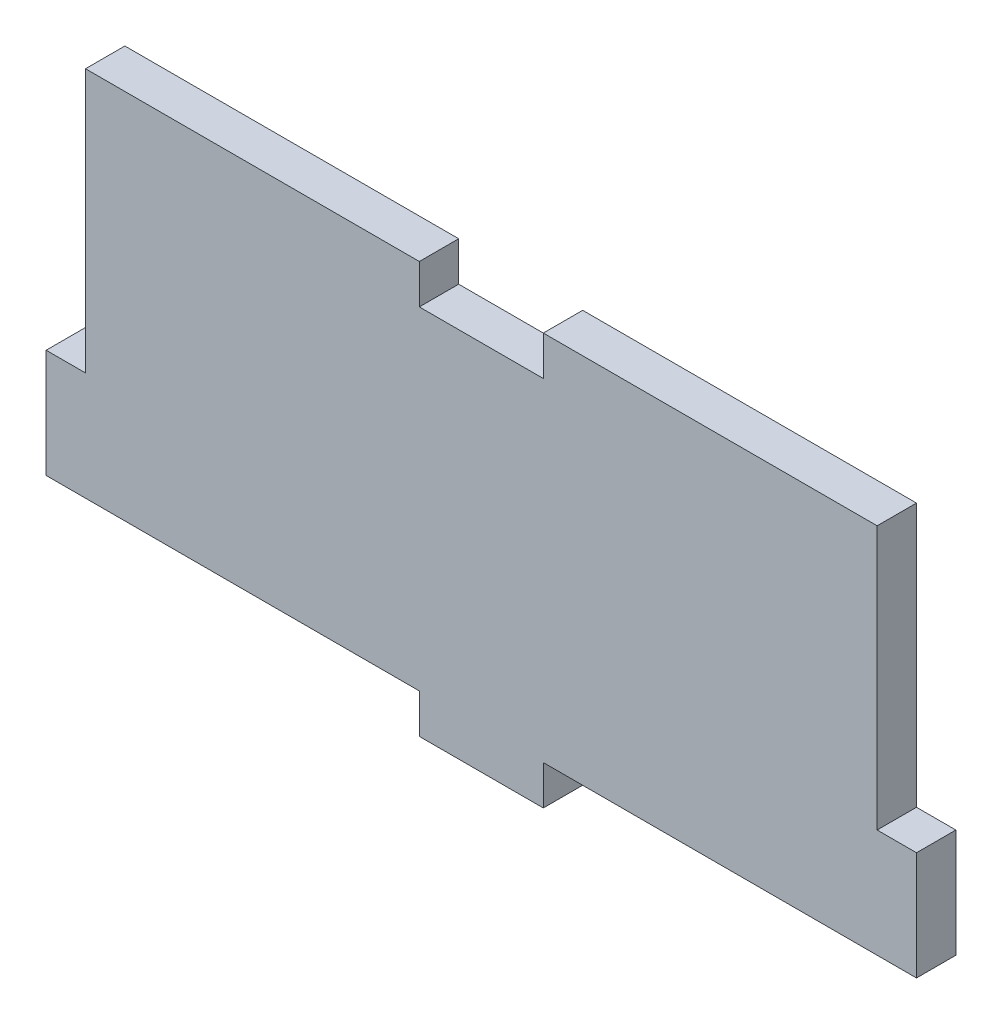
ISO-10303-21;
HEADER;
FILE_DESCRIPTION(('STEP AP214'),'2;1');
FILE_NAME('part.step','',(''),(''),'','','');
FILE_SCHEMA(('AUTOMOTIVE_DESIGN { 1 0 10303 214 1 1 1 1 }'));
ENDSEC;
DATA;
#1=APPLICATION_CONTEXT('core data for automotive mechanical design processes');
#2=APPLICATION_PROTOCOL_DEFINITION('international standard','automotive_design',2000,#1);
#3=PRODUCT_CONTEXT('',#1,'mechanical');
#4=PRODUCT('Part','Part','',(#3));
#5=PRODUCT_RELATED_PRODUCT_CATEGORY('part','',(#4));
#6=PRODUCT_DEFINITION_FORMATION('','',#4);
#7=PRODUCT_DEFINITION_CONTEXT('part definition',#1,'design');
#8=PRODUCT_DEFINITION('design','',#6,#7);
#9=PRODUCT_DEFINITION_SHAPE('','',#8);
#10=(LENGTH_UNIT() NAMED_UNIT(*) SI_UNIT(.MILLI.,.METRE.));
#11=(NAMED_UNIT(*) PLANE_ANGLE_UNIT() SI_UNIT($,.RADIAN.));
#12=(NAMED_UNIT(*) SI_UNIT($,.STERADIAN.) SOLID_ANGLE_UNIT());
#13=UNCERTAINTY_MEASURE_WITH_UNIT(LENGTH_MEASURE(1.E-05),#10,'distance_accuracy_value','');
#14=(GEOMETRIC_REPRESENTATION_CONTEXT(3) GLOBAL_UNCERTAINTY_ASSIGNED_CONTEXT((#13)) GLOBAL_UNIT_ASSIGNED_CONTEXT((#10,
#11,#12)) REPRESENTATION_CONTEXT('',''));
#15=CARTESIAN_POINT('',(0.,0.,0.));
#16=DIRECTION('',(0.,0.,1.));
#17=DIRECTION('',(1.,0.,0.));
#18=AXIS2_PLACEMENT_3D('',#15,#16,#17);
#19=CARTESIAN_POINT('',(-127.7,60.,12.7));
#20=DIRECTION('',(0.,1.,0.));
#21=DIRECTION('',(0.,0.,1.));
#22=AXIS2_PLACEMENT_3D('',#19,#20,#21);
#23=PLANE('',#22);
#24=DIRECTION('',(0.,0.,1.));
#25=VECTOR('',#24,1.);
#26=CARTESIAN_POINT('',(-20.,60.,0.));
#27=LINE('',#26,#25);
#28=CARTESIAN_POINT('',(-20.,60.,0.));
#29=VERTEX_POINT('',#28);
#30=CARTESIAN_POINT('',(-20.,60.,12.7));
#31=VERTEX_POINT('',#30);
#32=EDGE_CURVE('E175',#29,#31,#27,.T.);
#33=ORIENTED_EDGE('',*,*,#32,.F.);
#34=DIRECTION('',(1.,0.,0.));
#35=VECTOR('',#34,1.);
#36=CARTESIAN_POINT('',(-127.7,60.,0.));
#37=LINE('',#36,#35);
#38=CARTESIAN_POINT('',(-127.7,60.,0.));
#39=VERTEX_POINT('',#38);
#40=EDGE_CURVE('E277',#39,#29,#37,.T.);
#41=ORIENTED_EDGE('',*,*,#40,.F.);
#42=DIRECTION('',(0.,0.,-1.));
#43=VECTOR('',#42,1.);
#44=CARTESIAN_POINT('',(-127.7,60.,12.7));
#45=LINE('',#44,#43);
#46=CARTESIAN_POINT('',(-127.7,60.,12.7));
#47=VERTEX_POINT('',#46);
#48=EDGE_CURVE('E196',#47,#39,#45,.T.);
#49=ORIENTED_EDGE('',*,*,#48,.F.);
#50=DIRECTION('',(1.,0.,0.));
#51=VECTOR('',#50,1.);
#52=CARTESIAN_POINT('',(-127.7,60.,12.7));
#53=LINE('',#52,#51);
#54=EDGE_CURVE('E203',#47,#31,#53,.T.);
#55=ORIENTED_EDGE('',*,*,#54,.T.);
#56=EDGE_LOOP('',(#33,#41,#49,#55));
#57=FACE_BOUND('',#56,.T.);
#58=ADVANCED_FACE('F87',(#57),#23,.T.);
#59=DIRECTION('',(0.,0.,1.));
#60=VECTOR('',#59,1.);
#61=CARTESIAN_POINT('',(20.,60.,0.));
#62=LINE('',#61,#60);
#63=CARTESIAN_POINT('',(20.,60.,0.));
#64=VERTEX_POINT('',#63);
#65=CARTESIAN_POINT('',(20.,60.,12.7));
#66=VERTEX_POINT('',#65);
#67=EDGE_CURVE('E301',#64,#66,#62,.T.);
#68=ORIENTED_EDGE('',*,*,#67,.T.);
#69=CARTESIAN_POINT('',(127.7,60.,12.7));
#70=VERTEX_POINT('',#69);
#71=EDGE_CURVE('E287',#66,#70,#53,.T.);
#72=ORIENTED_EDGE('',*,*,#71,.T.);
#73=DIRECTION('',(0.,0.,-1.));
#74=VECTOR('',#73,1.);
#75=CARTESIAN_POINT('',(127.7,60.,12.7));
#76=LINE('',#75,#74);
#77=CARTESIAN_POINT('',(127.7,60.,0.));
#78=VERTEX_POINT('',#77);
#79=EDGE_CURVE('E190',#70,#78,#76,.T.);
#80=ORIENTED_EDGE('',*,*,#79,.T.);
#81=EDGE_CURVE('E280',#64,#78,#37,.T.);
#82=ORIENTED_EDGE('',*,*,#81,.F.);
#83=EDGE_LOOP('',(#68,#72,#80,#82));
#84=FACE_BOUND('',#83,.T.);
#85=ADVANCED_FACE('F298',(#84),#23,.T.);
#86=CARTESIAN_POINT('',(0.,0.,0.));
#87=DIRECTION('',(0.,0.,1.));
#88=DIRECTION('',(1.,0.,0.));
#89=AXIS2_PLACEMENT_3D('',#86,#87,#88);
#90=PLANE('',#89);
#91=ORIENTED_EDGE('',*,*,#40,.T.);
#92=DIRECTION('',(0.,-1.,0.));
#93=VECTOR('',#92,1.);
#94=CARTESIAN_POINT('',(-20.,60.,0.));
#95=LINE('',#94,#93);
#96=CARTESIAN_POINT('',(-20.,47.3,0.));
#97=VERTEX_POINT('',#96);
#98=EDGE_CURVE('E503',#29,#97,#95,.T.);
#99=ORIENTED_EDGE('',*,*,#98,.T.);
#100=DIRECTION('',(1.,0.,0.));
#101=VECTOR('',#100,1.);
#102=CARTESIAN_POINT('',(-20.,47.3,0.));
#103=LINE('',#102,#101);
#104=CARTESIAN_POINT('',(20.,47.3,0.));
#105=VERTEX_POINT('',#104);
#106=EDGE_CURVE('E506',#97,#105,#103,.T.);
#107=ORIENTED_EDGE('',*,*,#106,.T.);
#108=DIRECTION('',(0.,1.,0.));
#109=VECTOR('',#108,1.);
#110=CARTESIAN_POINT('',(20.,60.,0.));
#111=LINE('',#110,#109);
#112=EDGE_CURVE('E294',#105,#64,#111,.T.);
#113=ORIENTED_EDGE('',*,*,#112,.T.);
#114=ORIENTED_EDGE('',*,*,#81,.T.);
#115=DIRECTION('',(0.,-1.,0.));
#116=VECTOR('',#115,1.);
#117=CARTESIAN_POINT('',(127.7,60.,0.));
#118=LINE('',#117,#116);
#119=CARTESIAN_POINT('',(127.7,-25.,0.));
#120=VERTEX_POINT('',#119);
#121=EDGE_CURVE('E181',#78,#120,#118,.T.);
#122=ORIENTED_EDGE('',*,*,#121,.T.);
#123=DIRECTION('',(1.,0.,0.));
#124=VECTOR('',#123,1.);
#125=CARTESIAN_POINT('',(127.7,-25.,0.));
#126=LINE('',#125,#124);
#127=CARTESIAN_POINT('',(140.4,-25.,0.));
#128=VERTEX_POINT('',#127);
#129=EDGE_CURVE('E163',#120,#128,#126,.T.);
#130=ORIENTED_EDGE('',*,*,#129,.T.);
#131=DIRECTION('',(0.,1.,0.));
#132=VECTOR('',#131,1.);
#133=CARTESIAN_POINT('',(140.4,-60.,0.));
#134=LINE('',#133,#132);
#135=CARTESIAN_POINT('',(140.4,-60.,0.));
#136=VERTEX_POINT('',#135);
#137=EDGE_CURVE('E171',#136,#128,#134,.T.);
#138=ORIENTED_EDGE('',*,*,#137,.F.);
#139=DIRECTION('',(1.,0.,0.));
#140=VECTOR('',#139,1.);
#141=CARTESIAN_POINT('',(-127.7,-60.,0.));
#142=LINE('',#141,#140);
#143=CARTESIAN_POINT('',(20.,-60.,0.));
#144=VERTEX_POINT('',#143);
#145=EDGE_CURVE('E263',#144,#136,#142,.T.);
#146=ORIENTED_EDGE('',*,*,#145,.F.);
#147=DIRECTION('',(0.,-1.,0.));
#148=VECTOR('',#147,1.);
#149=CARTESIAN_POINT('',(20.,-60.,0.));
#150=LINE('',#149,#148);
#151=CARTESIAN_POINT('',(20.,-72.7,0.));
#152=VERTEX_POINT('',#151);
#153=EDGE_CURVE('E211',#144,#152,#150,.T.);
#154=ORIENTED_EDGE('',*,*,#153,.T.);
#155=DIRECTION('',(1.,0.,0.));
#156=VECTOR('',#155,1.);
#157=CARTESIAN_POINT('',(-20.,-72.7,0.));
#158=LINE('',#157,#156);
#159=CARTESIAN_POINT('',(-20.,-72.7,0.));
#160=VERTEX_POINT('',#159);
#161=EDGE_CURVE('E220',#160,#152,#158,.T.);
#162=ORIENTED_EDGE('',*,*,#161,.F.);
#163=DIRECTION('',(0.,-1.,0.));
#164=VECTOR('',#163,1.);
#165=CARTESIAN_POINT('',(-20.,-60.,0.));
#166=LINE('',#165,#164);
#167=CARTESIAN_POINT('',(-20.,-60.,0.));
#168=VERTEX_POINT('',#167);
#169=EDGE_CURVE('E217',#168,#160,#166,.T.);
#170=ORIENTED_EDGE('',*,*,#169,.F.);
#171=CARTESIAN_POINT('',(-140.4,-60.,0.));
#172=VERTEX_POINT('',#171);
#173=EDGE_CURVE('E259',#172,#168,#142,.T.);
#174=ORIENTED_EDGE('',*,*,#173,.F.);
#175=DIRECTION('',(0.,1.,0.));
#176=VECTOR('',#175,1.);
#177=CARTESIAN_POINT('',(-140.4,-60.,0.));
#178=LINE('',#177,#176);
#179=CARTESIAN_POINT('',(-140.4,-25.,0.));
#180=VERTEX_POINT('',#179);
#181=EDGE_CURVE('E236',#172,#180,#178,.T.);
#182=ORIENTED_EDGE('',*,*,#181,.T.);
#183=DIRECTION('',(-1.,0.,0.));
#184=VECTOR('',#183,1.);
#185=CARTESIAN_POINT('',(-127.7,-25.,0.));
#186=LINE('',#185,#184);
#187=CARTESIAN_POINT('',(-127.7,-25.,0.));
#188=VERTEX_POINT('',#187);
#189=EDGE_CURVE('E240',#188,#180,#186,.T.);
#190=ORIENTED_EDGE('',*,*,#189,.F.);
#191=DIRECTION('',(0.,-1.,0.));
#192=VECTOR('',#191,1.);
#193=CARTESIAN_POINT('',(-127.7,60.,0.));
#194=LINE('',#193,#192);
#195=EDGE_CURVE('E232',#39,#188,#194,.T.);
#196=ORIENTED_EDGE('',*,*,#195,.F.);
#197=EDGE_LOOP('',(#91,#99,#107,#113,#114,#122,#130,#138,#146,#154,#162,#170,#174,#182,#190,#196));
#198=FACE_BOUND('',#197,.T.);
#199=ADVANCED_FACE('F178',(#198),#90,.F.);
#200=CARTESIAN_POINT('',(0.,0.,12.7));
#201=DIRECTION('',(0.,0.,1.));
#202=DIRECTION('',(1.,0.,0.));
#203=AXIS2_PLACEMENT_3D('',#200,#201,#202);
#204=PLANE('',#203);
#205=DIRECTION('',(0.,-1.,0.));
#206=VECTOR('',#205,1.);
#207=CARTESIAN_POINT('',(-20.,60.,12.7));
#208=LINE('',#207,#206);
#209=CARTESIAN_POINT('',(-20.,47.3,12.7));
#210=VERTEX_POINT('',#209);
#211=EDGE_CURVE('E104',#31,#210,#208,.T.);
#212=ORIENTED_EDGE('',*,*,#211,.F.);
#213=ORIENTED_EDGE('',*,*,#54,.F.);
#214=DIRECTION('',(0.,-1.,0.));
#215=VECTOR('',#214,1.);
#216=CARTESIAN_POINT('',(-127.7,60.,12.7));
#217=LINE('',#216,#215);
#218=CARTESIAN_POINT('',(-127.7,-25.,12.7));
#219=VERTEX_POINT('',#218);
#220=EDGE_CURVE('E273',#47,#219,#217,.T.);
#221=ORIENTED_EDGE('',*,*,#220,.T.);
#222=DIRECTION('',(-1.,0.,0.));
#223=VECTOR('',#222,1.);
#224=CARTESIAN_POINT('',(-127.7,-25.,12.7));
#225=LINE('',#224,#223);
#226=CARTESIAN_POINT('',(-140.4,-25.,12.7));
#227=VERTEX_POINT('',#226);
#228=EDGE_CURVE('E233',#219,#227,#225,.T.);
#229=ORIENTED_EDGE('',*,*,#228,.T.);
#230=DIRECTION('',(0.,1.,0.));
#231=VECTOR('',#230,1.);
#232=CARTESIAN_POINT('',(-140.4,-60.,12.7));
#233=LINE('',#232,#231);
#234=CARTESIAN_POINT('',(-140.4,-60.,12.7));
#235=VERTEX_POINT('',#234);
#236=EDGE_CURVE('E235',#235,#227,#233,.T.);
#237=ORIENTED_EDGE('',*,*,#236,.F.);
#238=DIRECTION('',(1.,0.,0.));
#239=VECTOR('',#238,1.);
#240=CARTESIAN_POINT('',(-127.7,-60.,12.7));
#241=LINE('',#240,#239);
#242=CARTESIAN_POINT('',(-20.,-60.,12.7));
#243=VERTEX_POINT('',#242);
#244=EDGE_CURVE('E267',#235,#243,#241,.T.);
#245=ORIENTED_EDGE('',*,*,#244,.T.);
#246=DIRECTION('',(0.,-1.,0.));
#247=VECTOR('',#246,1.);
#248=CARTESIAN_POINT('',(-20.,-60.,12.7));
#249=LINE('',#248,#247);
#250=CARTESIAN_POINT('',(-20.,-72.7,12.7));
#251=VERTEX_POINT('',#250);
#252=EDGE_CURVE('E207',#243,#251,#249,.T.);
#253=ORIENTED_EDGE('',*,*,#252,.T.);
#254=DIRECTION('',(1.,0.,0.));
#255=VECTOR('',#254,1.);
#256=CARTESIAN_POINT('',(-20.,-72.7,12.7));
#257=LINE('',#256,#255);
#258=CARTESIAN_POINT('',(20.,-72.7,12.7));
#259=VERTEX_POINT('',#258);
#260=EDGE_CURVE('E210',#251,#259,#257,.T.);
#261=ORIENTED_EDGE('',*,*,#260,.T.);
#262=DIRECTION('',(0.,-1.,0.));
#263=VECTOR('',#262,1.);
#264=CARTESIAN_POINT('',(20.,-60.,12.7));
#265=LINE('',#264,#263);
#266=CARTESIAN_POINT('',(20.,-60.,12.7));
#267=VERTEX_POINT('',#266);
#268=EDGE_CURVE('E213',#267,#259,#265,.T.);
#269=ORIENTED_EDGE('',*,*,#268,.F.);
#270=CARTESIAN_POINT('',(140.4,-60.,12.7));
#271=VERTEX_POINT('',#270);
#272=EDGE_CURVE('E276',#267,#271,#241,.T.);
#273=ORIENTED_EDGE('',*,*,#272,.T.);
#274=DIRECTION('',(0.,1.,0.));
#275=VECTOR('',#274,1.);
#276=CARTESIAN_POINT('',(140.4,-60.,12.7));
#277=LINE('',#276,#275);
#278=CARTESIAN_POINT('',(140.4,-25.,12.7));
#279=VERTEX_POINT('',#278);
#280=EDGE_CURVE('E182',#271,#279,#277,.T.);
#281=ORIENTED_EDGE('',*,*,#280,.T.);
#282=DIRECTION('',(1.,0.,0.));
#283=VECTOR('',#282,1.);
#284=CARTESIAN_POINT('',(127.7,-25.,12.7));
#285=LINE('',#284,#283);
#286=CARTESIAN_POINT('',(127.7,-25.,12.7));
#287=VERTEX_POINT('',#286);
#288=EDGE_CURVE('E166',#287,#279,#285,.T.);
#289=ORIENTED_EDGE('',*,*,#288,.F.);
#290=DIRECTION('',(0.,-1.,0.));
#291=VECTOR('',#290,1.);
#292=CARTESIAN_POINT('',(127.7,60.,12.7));
#293=LINE('',#292,#291);
#294=EDGE_CURVE('E285',#70,#287,#293,.T.);
#295=ORIENTED_EDGE('',*,*,#294,.F.);
#296=ORIENTED_EDGE('',*,*,#71,.F.);
#297=DIRECTION('',(0.,1.,0.));
#298=VECTOR('',#297,1.);
#299=CARTESIAN_POINT('',(20.,60.,12.7));
#300=LINE('',#299,#298);
#301=CARTESIAN_POINT('',(20.,47.3,12.7));
#302=VERTEX_POINT('',#301);
#303=EDGE_CURVE('E500',#302,#66,#300,.T.);
#304=ORIENTED_EDGE('',*,*,#303,.F.);
#305=DIRECTION('',(1.,0.,0.));
#306=VECTOR('',#305,1.);
#307=CARTESIAN_POINT('',(-20.,47.3,12.7));
#308=LINE('',#307,#306);
#309=EDGE_CURVE('E496',#210,#302,#308,.T.);
#310=ORIENTED_EDGE('',*,*,#309,.F.);
#311=EDGE_LOOP('',(#212,#213,#221,#229,#237,#245,#253,#261,#269,#273,#281,#289,#295,#296,#304,#310));
#312=FACE_BOUND('',#311,.T.);
#313=ADVANCED_FACE('F269',(#312),#204,.T.);
#314=CARTESIAN_POINT('',(127.7,60.,12.7));
#315=DIRECTION('',(1.,0.,0.));
#316=DIRECTION('',(0.,0.,-1.));
#317=AXIS2_PLACEMENT_3D('',#314,#315,#316);
#318=PLANE('',#317);
#319=ORIENTED_EDGE('',*,*,#294,.T.);
#320=DIRECTION('',(0.,0.,-1.));
#321=VECTOR('',#320,1.);
#322=CARTESIAN_POINT('',(127.7,-25.,12.7));
#323=LINE('',#322,#321);
#324=EDGE_CURVE('E187',#287,#120,#323,.T.);
#325=ORIENTED_EDGE('',*,*,#324,.T.);
#326=ORIENTED_EDGE('',*,*,#121,.F.);
#327=ORIENTED_EDGE('',*,*,#79,.F.);
#328=EDGE_LOOP('',(#319,#325,#326,#327));
#329=FACE_BOUND('',#328,.T.);
#330=ADVANCED_FACE('F369',(#329),#318,.T.);
#331=CARTESIAN_POINT('',(-127.7,-60.,12.7));
#332=DIRECTION('',(0.,1.,0.));
#333=DIRECTION('',(0.,0.,1.));
#334=AXIS2_PLACEMENT_3D('',#331,#332,#333);
#335=PLANE('',#334);
#336=ORIENTED_EDGE('',*,*,#272,.F.);
#337=DIRECTION('',(0.,0.,-1.));
#338=VECTOR('',#337,1.);
#339=CARTESIAN_POINT('',(20.,-60.,12.7));
#340=LINE('',#339,#338);
#341=EDGE_CURVE('E189',#267,#144,#340,.T.);
#342=ORIENTED_EDGE('',*,*,#341,.T.);
#343=ORIENTED_EDGE('',*,*,#145,.T.);
#344=DIRECTION('',(0.,0.,-1.));
#345=VECTOR('',#344,1.);
#346=CARTESIAN_POINT('',(140.4,-60.,12.7));
#347=LINE('',#346,#345);
#348=EDGE_CURVE('E91',#271,#136,#347,.T.);
#349=ORIENTED_EDGE('',*,*,#348,.F.);
#350=EDGE_LOOP('',(#336,#342,#343,#349));
#351=FACE_BOUND('',#350,.T.);
#352=ADVANCED_FACE('F339',(#351),#335,.F.);
#353=DIRECTION('',(0.,0.,-1.));
#354=VECTOR('',#353,1.);
#355=CARTESIAN_POINT('',(-20.,-60.,12.7));
#356=LINE('',#355,#354);
#357=EDGE_CURVE('E96',#243,#168,#356,.T.);
#358=ORIENTED_EDGE('',*,*,#357,.F.);
#359=ORIENTED_EDGE('',*,*,#244,.F.);
#360=DIRECTION('',(0.,0.,-1.));
#361=VECTOR('',#360,1.);
#362=CARTESIAN_POINT('',(-140.4,-60.,12.7));
#363=LINE('',#362,#361);
#364=EDGE_CURVE('E239',#235,#172,#363,.T.);
#365=ORIENTED_EDGE('',*,*,#364,.T.);
#366=ORIENTED_EDGE('',*,*,#173,.T.);
#367=EDGE_LOOP('',(#358,#359,#365,#366));
#368=FACE_BOUND('',#367,.T.);
#369=ADVANCED_FACE('F265',(#368),#335,.F.);
#370=CARTESIAN_POINT('',(-127.7,60.,12.7));
#371=DIRECTION('',(1.,0.,0.));
#372=DIRECTION('',(0.,0.,-1.));
#373=AXIS2_PLACEMENT_3D('',#370,#371,#372);
#374=PLANE('',#373);
#375=DIRECTION('',(0.,0.,-1.));
#376=VECTOR('',#375,1.);
#377=CARTESIAN_POINT('',(-127.7,-25.,12.7));
#378=LINE('',#377,#376);
#379=EDGE_CURVE('E12',#219,#188,#378,.T.);
#380=ORIENTED_EDGE('',*,*,#379,.F.);
#381=ORIENTED_EDGE('',*,*,#220,.F.);
#382=ORIENTED_EDGE('',*,*,#48,.T.);
#383=ORIENTED_EDGE('',*,*,#195,.T.);
#384=EDGE_LOOP('',(#380,#381,#382,#383));
#385=FACE_BOUND('',#384,.T.);
#386=ADVANCED_FACE('F374',(#385),#374,.F.);
#387=CARTESIAN_POINT('',(140.4,-60.,12.7));
#388=DIRECTION('',(-1.,0.,0.));
#389=DIRECTION('',(0.,0.,1.));
#390=AXIS2_PLACEMENT_3D('',#387,#388,#389);
#391=PLANE('',#390);
#392=ORIENTED_EDGE('',*,*,#137,.T.);
#393=DIRECTION('',(0.,0.,-1.));
#394=VECTOR('',#393,1.);
#395=CARTESIAN_POINT('',(140.4,-25.,12.7));
#396=LINE('',#395,#394);
#397=EDGE_CURVE('E157',#279,#128,#396,.T.);
#398=ORIENTED_EDGE('',*,*,#397,.F.);
#399=ORIENTED_EDGE('',*,*,#280,.F.);
#400=ORIENTED_EDGE('',*,*,#348,.T.);
#401=EDGE_LOOP('',(#392,#398,#399,#400));
#402=FACE_BOUND('',#401,.T.);
#403=ADVANCED_FACE('F89',(#402),#391,.F.);
#404=CARTESIAN_POINT('',(127.7,-25.,12.7));
#405=DIRECTION('',(0.,1.,0.));
#406=DIRECTION('',(-1.,0.,0.));
#407=AXIS2_PLACEMENT_3D('',#404,#405,#406);
#408=PLANE('',#407);
#409=ORIENTED_EDGE('',*,*,#129,.F.);
#410=ORIENTED_EDGE('',*,*,#324,.F.);
#411=ORIENTED_EDGE('',*,*,#288,.T.);
#412=ORIENTED_EDGE('',*,*,#397,.T.);
#413=EDGE_LOOP('',(#409,#410,#411,#412));
#414=FACE_BOUND('',#413,.T.);
#415=ADVANCED_FACE('F159',(#414),#408,.T.);
#416=CARTESIAN_POINT('',(-20.,-72.7,12.7));
#417=DIRECTION('',(0.,1.,0.));
#418=DIRECTION('',(0.,0.,1.));
#419=AXIS2_PLACEMENT_3D('',#416,#417,#418);
#420=PLANE('',#419);
#421=ORIENTED_EDGE('',*,*,#161,.T.);
#422=DIRECTION('',(0.,0.,-1.));
#423=VECTOR('',#422,1.);
#424=CARTESIAN_POINT('',(20.,-72.7,12.7));
#425=LINE('',#424,#423);
#426=EDGE_CURVE('E216',#259,#152,#425,.T.);
#427=ORIENTED_EDGE('',*,*,#426,.F.);
#428=ORIENTED_EDGE('',*,*,#260,.F.);
#429=DIRECTION('',(0.,0.,-1.));
#430=VECTOR('',#429,1.);
#431=CARTESIAN_POINT('',(-20.,-72.7,12.7));
#432=LINE('',#431,#430);
#433=EDGE_CURVE('E229',#251,#160,#432,.T.);
#434=ORIENTED_EDGE('',*,*,#433,.T.);
#435=EDGE_LOOP('',(#421,#427,#428,#434));
#436=FACE_BOUND('',#435,.T.);
#437=ADVANCED_FACE('F342',(#436),#420,.F.);
#438=CARTESIAN_POINT('',(20.,-60.,12.7));
#439=DIRECTION('',(1.,0.,0.));
#440=DIRECTION('',(0.,0.,-1.));
#441=AXIS2_PLACEMENT_3D('',#438,#439,#440);
#442=PLANE('',#441);
#443=ORIENTED_EDGE('',*,*,#153,.F.);
#444=ORIENTED_EDGE('',*,*,#341,.F.);
#445=ORIENTED_EDGE('',*,*,#268,.T.);
#446=ORIENTED_EDGE('',*,*,#426,.T.);
#447=EDGE_LOOP('',(#443,#444,#445,#446));
#448=FACE_BOUND('',#447,.T.);
#449=ADVANCED_FACE('F335',(#448),#442,.T.);
#450=CARTESIAN_POINT('',(-20.,-60.,12.7));
#451=DIRECTION('',(1.,0.,0.));
#452=DIRECTION('',(0.,1.,0.));
#453=AXIS2_PLACEMENT_3D('',#450,#451,#452);
#454=PLANE('',#453);
#455=ORIENTED_EDGE('',*,*,#169,.T.);
#456=ORIENTED_EDGE('',*,*,#433,.F.);
#457=ORIENTED_EDGE('',*,*,#252,.F.);
#458=ORIENTED_EDGE('',*,*,#357,.T.);
#459=EDGE_LOOP('',(#455,#456,#457,#458));
#460=FACE_BOUND('',#459,.T.);
#461=ADVANCED_FACE('F345',(#460),#454,.F.);
#462=CARTESIAN_POINT('',(-140.4,-60.,12.7));
#463=DIRECTION('',(-1.,0.,0.));
#464=DIRECTION('',(0.,0.,1.));
#465=AXIS2_PLACEMENT_3D('',#462,#463,#464);
#466=PLANE('',#465);
#467=ORIENTED_EDGE('',*,*,#181,.F.);
#468=ORIENTED_EDGE('',*,*,#364,.F.);
#469=ORIENTED_EDGE('',*,*,#236,.T.);
#470=DIRECTION('',(0.,0.,-1.));
#471=VECTOR('',#470,1.);
#472=CARTESIAN_POINT('',(-140.4,-25.,12.7));
#473=LINE('',#472,#471);
#474=EDGE_CURVE('E221',#227,#180,#473,.T.);
#475=ORIENTED_EDGE('',*,*,#474,.T.);
#476=EDGE_LOOP('',(#467,#468,#469,#475));
#477=FACE_BOUND('',#476,.T.);
#478=ADVANCED_FACE('F250',(#477),#466,.T.);
#479=CARTESIAN_POINT('',(-127.7,-25.,12.7));
#480=DIRECTION('',(0.,-1.,0.));
#481=DIRECTION('',(0.,0.,-1.));
#482=AXIS2_PLACEMENT_3D('',#479,#480,#481);
#483=PLANE('',#482);
#484=ORIENTED_EDGE('',*,*,#189,.T.);
#485=ORIENTED_EDGE('',*,*,#474,.F.);
#486=ORIENTED_EDGE('',*,*,#228,.F.);
#487=ORIENTED_EDGE('',*,*,#379,.T.);
#488=EDGE_LOOP('',(#484,#485,#486,#487));
#489=FACE_BOUND('',#488,.T.);
#490=ADVANCED_FACE('F255',(#489),#483,.F.);
#491=CARTESIAN_POINT('',(-20.,60.,0.));
#492=DIRECTION('',(-1.,0.,0.));
#493=DIRECTION('',(0.,0.,1.));
#494=AXIS2_PLACEMENT_3D('',#491,#492,#493);
#495=PLANE('',#494);
#496=ORIENTED_EDGE('',*,*,#211,.T.);
#497=DIRECTION('',(0.,0.,1.));
#498=VECTOR('',#497,1.);
#499=CARTESIAN_POINT('',(-20.,47.3,0.));
#500=LINE('',#499,#498);
#501=EDGE_CURVE('E282',#97,#210,#500,.T.);
#502=ORIENTED_EDGE('',*,*,#501,.F.);
#503=ORIENTED_EDGE('',*,*,#98,.F.);
#504=ORIENTED_EDGE('',*,*,#32,.T.);
#505=EDGE_LOOP('',(#496,#502,#503,#504));
#506=FACE_BOUND('',#505,.T.);
#507=ADVANCED_FACE('F353',(#506),#495,.F.);
#508=CARTESIAN_POINT('',(20.,60.,0.));
#509=DIRECTION('',(1.,0.,0.));
#510=DIRECTION('',(0.,1.,0.));
#511=AXIS2_PLACEMENT_3D('',#508,#509,#510);
#512=PLANE('',#511);
#513=ORIENTED_EDGE('',*,*,#303,.T.);
#514=ORIENTED_EDGE('',*,*,#67,.F.);
#515=ORIENTED_EDGE('',*,*,#112,.F.);
#516=DIRECTION('',(0.,0.,1.));
#517=VECTOR('',#516,1.);
#518=CARTESIAN_POINT('',(20.,47.3,0.));
#519=LINE('',#518,#517);
#520=EDGE_CURVE('E499',#105,#302,#519,.T.);
#521=ORIENTED_EDGE('',*,*,#520,.T.);
#522=EDGE_LOOP('',(#513,#514,#515,#521));
#523=FACE_BOUND('',#522,.T.);
#524=ADVANCED_FACE('F458',(#523),#512,.F.);
#525=CARTESIAN_POINT('',(-20.,47.3,0.));
#526=DIRECTION('',(0.,-1.,0.));
#527=DIRECTION('',(0.,0.,-1.));
#528=AXIS2_PLACEMENT_3D('',#525,#526,#527);
#529=PLANE('',#528);
#530=ORIENTED_EDGE('',*,*,#309,.T.);
#531=ORIENTED_EDGE('',*,*,#520,.F.);
#532=ORIENTED_EDGE('',*,*,#106,.F.);
#533=ORIENTED_EDGE('',*,*,#501,.T.);
#534=EDGE_LOOP('',(#530,#531,#532,#533));
#535=FACE_BOUND('',#534,.T.);
#536=ADVANCED_FACE('F466',(#535),#529,.F.);
#537=CLOSED_SHELL('',(#58,#85,#199,#313,#330,#352,#369,#386,#403,#415,#437,#449,#461,#478,#490,
#507,#524,#536));
#538=MANIFOLD_SOLID_BREP('B2',#537);
#539=ADVANCED_BREP_SHAPE_REPRESENTATION('',(#18,#538),#14);
#540=SHAPE_DEFINITION_REPRESENTATION(#9,#539);
ENDSEC;
END-ISO-10303-21;
